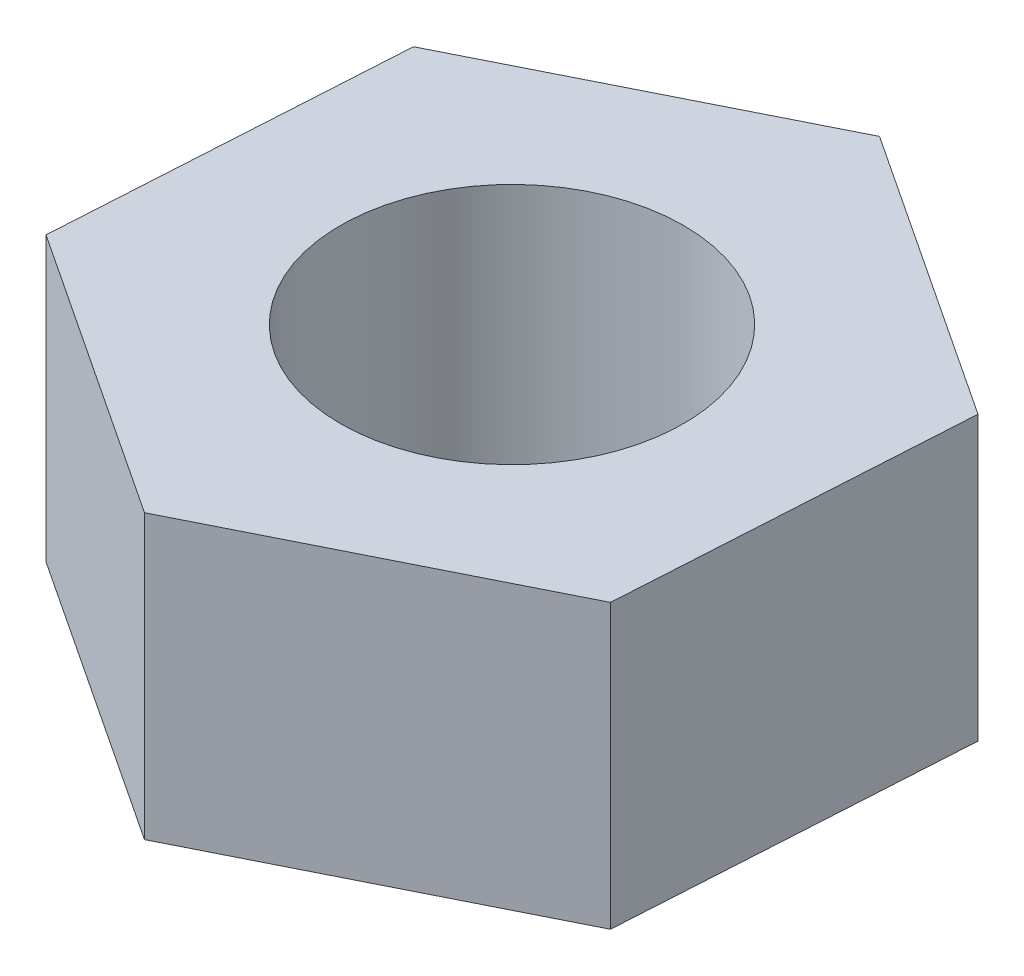
ISO-10303-21;
HEADER;
FILE_DESCRIPTION(('STEP AP214'),'2;1');
FILE_NAME('part.step','',(''),(''),'','','');
FILE_SCHEMA(('AUTOMOTIVE_DESIGN { 1 0 10303 214 1 1 1 1 }'));
ENDSEC;
DATA;
#1=APPLICATION_CONTEXT('core data for automotive mechanical design processes');
#2=APPLICATION_PROTOCOL_DEFINITION('international standard','automotive_design',2000,#1);
#3=PRODUCT_CONTEXT('',#1,'mechanical');
#4=PRODUCT('Part','Part','',(#3));
#5=PRODUCT_RELATED_PRODUCT_CATEGORY('part','',(#4));
#6=PRODUCT_DEFINITION_FORMATION('','',#4);
#7=PRODUCT_DEFINITION_CONTEXT('part definition',#1,'design');
#8=PRODUCT_DEFINITION('design','',#6,#7);
#9=PRODUCT_DEFINITION_SHAPE('','',#8);
#10=(LENGTH_UNIT() NAMED_UNIT(*) SI_UNIT(.MILLI.,.METRE.));
#11=(NAMED_UNIT(*) PLANE_ANGLE_UNIT() SI_UNIT($,.RADIAN.));
#12=(NAMED_UNIT(*) SI_UNIT($,.STERADIAN.) SOLID_ANGLE_UNIT());
#13=UNCERTAINTY_MEASURE_WITH_UNIT(LENGTH_MEASURE(1.E-05),#10,'distance_accuracy_value','');
#14=(GEOMETRIC_REPRESENTATION_CONTEXT(3) GLOBAL_UNCERTAINTY_ASSIGNED_CONTEXT((#13)) GLOBAL_UNIT_ASSIGNED_CONTEXT((#10,
#11,#12)) REPRESENTATION_CONTEXT('',''));
#15=CARTESIAN_POINT('',(0.,0.,0.));
#16=DIRECTION('',(0.,0.,1.));
#17=DIRECTION('',(1.,0.,0.));
#18=AXIS2_PLACEMENT_3D('',#15,#16,#17);
#19=CARTESIAN_POINT('',(1.77635683940025E-12,7.99999999999201,0.));
#20=DIRECTION('',(0.,1.,0.));
#21=DIRECTION('',(0.,0.,1.));
#22=AXIS2_PLACEMENT_3D('',#19,#20,#21);
#23=PLANE('',#22);
#24=DIRECTION('',(-0.0599152608792087,0.,0.998203466991464));
#25=VECTOR('',#24,1.);
#26=CARTESIAN_POINT('',(-8.1906966874512,7.99999999999823,-5.40794056064842));
#27=LINE('',#26,#25);
#28=CARTESIAN_POINT('',(-8.1906966874512,7.99999999999823,-5.40794056064842));
#29=VERTEX_POINT('',#28);
#30=CARTESIAN_POINT('',(-8.77876225140284,7.99999999999823,4.38938112570098));
#31=VERTEX_POINT('',#30);
#32=EDGE_CURVE('E128',#29,#31,#27,.T.);
#33=ORIENTED_EDGE('',*,*,#32,.T.);
#34=DIRECTION('',(0.834511930120703,0.,0.550989871491497));
#35=VECTOR('',#34,1.);
#36=CARTESIAN_POINT('',(-8.77876225140284,7.99999999999823,4.38938112570098));
#37=LINE('',#36,#35);
#38=CARTESIAN_POINT('',(-0.588065563952966,7.99999999999379,9.79732168634939));
#39=VERTEX_POINT('',#38);
#40=EDGE_CURVE('E86',#31,#39,#37,.T.);
#41=ORIENTED_EDGE('',*,*,#40,.T.);
#42=DIRECTION('',(0.894427190999911,0.,-0.447213595499967));
#43=VECTOR('',#42,1.);
#44=CARTESIAN_POINT('',(-0.588065563952966,7.99999999999379,9.79732168634939));
#45=LINE('',#44,#43);
#46=CARTESIAN_POINT('',(8.19069668745254,7.99999999999645,5.40794056064797));
#47=VERTEX_POINT('',#46);
#48=EDGE_CURVE('E99',#39,#47,#45,.T.);
#49=ORIENTED_EDGE('',*,*,#48,.T.);
#50=DIRECTION('',(0.0599152608792083,0.,-0.998203466991464));
#51=VECTOR('',#50,1.);
#52=CARTESIAN_POINT('',(8.19069668745254,7.99999999999645,5.40794056064797));
#53=LINE('',#52,#51);
#54=CARTESIAN_POINT('',(8.77876225140461,7.99999999999912,-4.38938112570364));
#55=VERTEX_POINT('',#54);
#56=EDGE_CURVE('E93',#47,#55,#53,.T.);
#57=ORIENTED_EDGE('',*,*,#56,.T.);
#58=DIRECTION('',(-0.834511930120703,0.,-0.550989871491497));
#59=VECTOR('',#58,1.);
#60=CARTESIAN_POINT('',(8.77876225140461,7.99999999999912,-4.38938112570364));
#61=LINE('',#60,#59);
#62=CARTESIAN_POINT('',(0.588065563950302,7.99999999999557,-9.79732168634984));
#63=VERTEX_POINT('',#62);
#64=EDGE_CURVE('E97',#55,#63,#61,.T.);
#65=ORIENTED_EDGE('',*,*,#64,.T.);
#66=DIRECTION('',(-0.894427190999911,0.,0.447213595499967));
#67=VECTOR('',#66,1.);
#68=CARTESIAN_POINT('',(0.588065563950302,7.99999999999557,-9.79732168634984));
#69=LINE('',#68,#67);
#70=EDGE_CURVE('E49',#63,#29,#69,.T.);
#71=ORIENTED_EDGE('',*,*,#70,.T.);
#72=EDGE_LOOP('',(#33,#41,#49,#57,#65,#71));
#73=FACE_BOUND('',#72,.T.);
#74=CARTESIAN_POINT('',(1.77635683940025E-12,7.99999999999201,0.));
#75=DIRECTION('',(0.,1.,0.));
#76=DIRECTION('',(0.,0.,1.));
#77=AXIS2_PLACEMENT_3D('',#74,#75,#76);
#78=CIRCLE('',#77,4.85);
#79=CARTESIAN_POINT('',(1.77348326589654E-12,7.99999999999201,4.85000000000001));
#80=VERTEX_POINT('',#79);
#81=EDGE_CURVE('E121',#80,#80,#78,.T.);
#82=ORIENTED_EDGE('',*,*,#81,.F.);
#83=EDGE_LOOP('',(#82));
#84=FACE_BOUND('',#83,.T.);
#85=ADVANCED_FACE('F32',(#73,#84),#23,.T.);
#86=CARTESIAN_POINT('',(0.,0.,0.));
#87=DIRECTION('',(0.,1.,0.));
#88=DIRECTION('',(0.,0.,1.));
#89=AXIS2_PLACEMENT_3D('',#86,#87,#88);
#90=PLANE('',#89);
#91=DIRECTION('',(-0.0599152608792087,0.,0.998203466991464));
#92=VECTOR('',#91,1.);
#93=CARTESIAN_POINT('',(-8.19069668745076,-1.77635683940025E-12,-5.40794056064886));
#94=LINE('',#93,#92);
#95=CARTESIAN_POINT('',(-8.19069668745076,-1.77635683940025E-12,-5.40794056064886));
#96=VERTEX_POINT('',#95);
#97=CARTESIAN_POINT('',(-8.77876225140328,-2.66453525910038E-12,4.38938112570231));
#98=VERTEX_POINT('',#97);
#99=EDGE_CURVE('E117',#96,#98,#94,.T.);
#100=ORIENTED_EDGE('',*,*,#99,.F.);
#101=DIRECTION('',(-0.894427190999911,0.,0.447213595499967));
#102=VECTOR('',#101,1.);
#103=CARTESIAN_POINT('',(0.588065563951634,3.5527136788005E-12,-9.79732168635072));
#104=LINE('',#103,#102);
#105=CARTESIAN_POINT('',(0.588065563951634,3.5527136788005E-12,-9.79732168635072));
#106=VERTEX_POINT('',#105);
#107=EDGE_CURVE('E78',#106,#96,#104,.T.);
#108=ORIENTED_EDGE('',*,*,#107,.F.);
#109=DIRECTION('',(-0.834511930120703,0.,-0.550989871491497));
#110=VECTOR('',#109,1.);
#111=CARTESIAN_POINT('',(8.77876225140328,-6.21724893790088E-12,-4.38938112570275));
#112=LINE('',#111,#110);
#113=CARTESIAN_POINT('',(8.77876225140328,-6.21724893790088E-12,-4.38938112570275));
#114=VERTEX_POINT('',#113);
#115=EDGE_CURVE('E72',#114,#106,#112,.T.);
#116=ORIENTED_EDGE('',*,*,#115,.F.);
#117=DIRECTION('',(0.0599152608792083,0.,-0.998203466991464));
#118=VECTOR('',#117,1.);
#119=CARTESIAN_POINT('',(8.19069668745165,0.,5.40794056064797));
#120=LINE('',#119,#118);
#121=CARTESIAN_POINT('',(8.19069668745165,0.,5.40794056064797));
#122=VERTEX_POINT('',#121);
#123=EDGE_CURVE('E107',#122,#114,#120,.T.);
#124=ORIENTED_EDGE('',*,*,#123,.F.);
#125=DIRECTION('',(0.894427190999911,0.,-0.447213595499967));
#126=VECTOR('',#125,1.);
#127=CARTESIAN_POINT('',(-0.588065563950746,-4.44089209850063E-12,9.79732168635072));
#128=LINE('',#127,#126);
#129=CARTESIAN_POINT('',(-0.588065563950746,-4.44089209850063E-12,9.79732168635072));
#130=VERTEX_POINT('',#129);
#131=EDGE_CURVE('E123',#130,#122,#128,.T.);
#132=ORIENTED_EDGE('',*,*,#131,.F.);
#133=DIRECTION('',(0.834511930120703,0.,0.550989871491497));
#134=VECTOR('',#133,1.);
#135=CARTESIAN_POINT('',(-8.77876225140328,-2.66453525910038E-12,4.38938112570231));
#136=LINE('',#135,#134);
#137=EDGE_CURVE('E120',#98,#130,#136,.T.);
#138=ORIENTED_EDGE('',*,*,#137,.F.);
#139=EDGE_LOOP('',(#100,#108,#116,#124,#132,#138));
#140=FACE_BOUND('',#139,.T.);
#141=CARTESIAN_POINT('',(0.,0.,0.));
#142=DIRECTION('',(0.,1.,0.));
#143=DIRECTION('',(0.,0.,1.));
#144=AXIS2_PLACEMENT_3D('',#141,#142,#143);
#145=CIRCLE('',#144,4.85);
#146=CARTESIAN_POINT('',(0.,0.,4.85000000000001));
#147=VERTEX_POINT('',#146);
#148=EDGE_CURVE('E221',#147,#147,#145,.T.);
#149=ORIENTED_EDGE('',*,*,#148,.T.);
#150=EDGE_LOOP('',(#149));
#151=FACE_BOUND('',#150,.T.);
#152=ADVANCED_FACE('F137',(#140,#151),#90,.F.);
#153=CARTESIAN_POINT('',(-8.1906966874512,7.99999999999823,-5.40794056064842));
#154=DIRECTION('',(0.998203466991461,0.,0.0599152608792065));
#155=DIRECTION('',(0.0599152608792087,0.,-0.998203466991464));
#156=AXIS2_PLACEMENT_3D('',#153,#154,#155);
#157=PLANE('',#156);
#158=ORIENTED_EDGE('',*,*,#99,.T.);
#159=DIRECTION('',(0.,-1.,0.));
#160=VECTOR('',#159,1.);
#161=CARTESIAN_POINT('',(-8.77876225140284,7.99999999999823,4.38938112570098));
#162=LINE('',#161,#160);
#163=EDGE_CURVE('E11',#31,#98,#162,.T.);
#164=ORIENTED_EDGE('',*,*,#163,.F.);
#165=ORIENTED_EDGE('',*,*,#32,.F.);
#166=DIRECTION('',(0.,-1.,0.));
#167=VECTOR('',#166,1.);
#168=CARTESIAN_POINT('',(-8.1906966874512,7.99999999999823,-5.40794056064842));
#169=LINE('',#168,#167);
#170=EDGE_CURVE('E113',#29,#96,#169,.T.);
#171=ORIENTED_EDGE('',*,*,#170,.T.);
#172=EDGE_LOOP('',(#158,#164,#165,#171));
#173=FACE_BOUND('',#172,.T.);
#174=ADVANCED_FACE('F34',(#173),#157,.F.);
#175=CARTESIAN_POINT('',(-8.77876225140284,7.99999999999823,4.38938112570098));
#176=DIRECTION('',(0.550989871491498,0.,-0.834511930120705));
#177=DIRECTION('',(-0.834511930120703,0.,-0.550989871491497));
#178=AXIS2_PLACEMENT_3D('',#175,#176,#177);
#179=PLANE('',#178);
#180=ORIENTED_EDGE('',*,*,#137,.T.);
#181=DIRECTION('',(0.,-1.,0.));
#182=VECTOR('',#181,1.);
#183=CARTESIAN_POINT('',(-0.588065563952966,7.99999999999379,9.79732168634939));
#184=LINE('',#183,#182);
#185=EDGE_CURVE('E41',#39,#130,#184,.T.);
#186=ORIENTED_EDGE('',*,*,#185,.F.);
#187=ORIENTED_EDGE('',*,*,#40,.F.);
#188=ORIENTED_EDGE('',*,*,#163,.T.);
#189=EDGE_LOOP('',(#180,#186,#187,#188));
#190=FACE_BOUND('',#189,.T.);
#191=ADVANCED_FACE('F162',(#190),#179,.F.);
#192=CARTESIAN_POINT('',(-0.588065563952966,7.99999999999379,9.79732168634939));
#193=DIRECTION('',(-0.447213595499965,0.,-0.894427190999914));
#194=DIRECTION('',(-0.894427190999911,0.,0.447213595499967));
#195=AXIS2_PLACEMENT_3D('',#192,#193,#194);
#196=PLANE('',#195);
#197=ORIENTED_EDGE('',*,*,#131,.T.);
#198=DIRECTION('',(0.,-1.,0.));
#199=VECTOR('',#198,1.);
#200=CARTESIAN_POINT('',(8.19069668745254,7.99999999999645,5.40794056064797));
#201=LINE('',#200,#199);
#202=EDGE_CURVE('E108',#47,#122,#201,.T.);
#203=ORIENTED_EDGE('',*,*,#202,.F.);
#204=ORIENTED_EDGE('',*,*,#48,.F.);
#205=ORIENTED_EDGE('',*,*,#185,.T.);
#206=EDGE_LOOP('',(#197,#203,#204,#205));
#207=FACE_BOUND('',#206,.T.);
#208=ADVANCED_FACE('F134',(#207),#196,.F.);
#209=CARTESIAN_POINT('',(8.19069668745254,7.99999999999645,5.40794056064797));
#210=DIRECTION('',(-0.998203466991461,0.,-0.0599152608792071));
#211=DIRECTION('',(-0.0599152608792083,0.,0.998203466991464));
#212=AXIS2_PLACEMENT_3D('',#209,#210,#211);
#213=PLANE('',#212);
#214=ORIENTED_EDGE('',*,*,#123,.T.);
#215=DIRECTION('',(0.,-1.,0.));
#216=VECTOR('',#215,1.);
#217=CARTESIAN_POINT('',(8.77876225140461,7.99999999999912,-4.38938112570364));
#218=LINE('',#217,#216);
#219=EDGE_CURVE('E104',#55,#114,#218,.T.);
#220=ORIENTED_EDGE('',*,*,#219,.F.);
#221=ORIENTED_EDGE('',*,*,#56,.F.);
#222=ORIENTED_EDGE('',*,*,#202,.T.);
#223=EDGE_LOOP('',(#214,#220,#221,#222));
#224=FACE_BOUND('',#223,.T.);
#225=ADVANCED_FACE('F105',(#224),#213,.F.);
#226=CARTESIAN_POINT('',(8.77876225140461,7.99999999999912,-4.38938112570364));
#227=DIRECTION('',(-0.550989871491498,0.,0.834511930120705));
#228=DIRECTION('',(0.834511930120703,0.,0.550989871491497));
#229=AXIS2_PLACEMENT_3D('',#226,#227,#228);
#230=PLANE('',#229);
#231=ORIENTED_EDGE('',*,*,#115,.T.);
#232=DIRECTION('',(0.,-1.,0.));
#233=VECTOR('',#232,1.);
#234=CARTESIAN_POINT('',(0.588065563950302,7.99999999999557,-9.79732168634984));
#235=LINE('',#234,#233);
#236=EDGE_CURVE('E109',#63,#106,#235,.T.);
#237=ORIENTED_EDGE('',*,*,#236,.F.);
#238=ORIENTED_EDGE('',*,*,#64,.F.);
#239=ORIENTED_EDGE('',*,*,#219,.T.);
#240=EDGE_LOOP('',(#231,#237,#238,#239));
#241=FACE_BOUND('',#240,.T.);
#242=ADVANCED_FACE('F111',(#241),#230,.F.);
#243=CARTESIAN_POINT('',(0.588065563950302,7.99999999999557,-9.79732168634984));
#244=DIRECTION('',(0.447213595499965,0.,0.894427190999914));
#245=DIRECTION('',(0.894427190999911,0.,-0.447213595499967));
#246=AXIS2_PLACEMENT_3D('',#243,#244,#245);
#247=PLANE('',#246);
#248=ORIENTED_EDGE('',*,*,#107,.T.);
#249=ORIENTED_EDGE('',*,*,#170,.F.);
#250=ORIENTED_EDGE('',*,*,#70,.F.);
#251=ORIENTED_EDGE('',*,*,#236,.T.);
#252=EDGE_LOOP('',(#248,#249,#250,#251));
#253=FACE_BOUND('',#252,.T.);
#254=ADVANCED_FACE('F142',(#253),#247,.F.);
#255=CARTESIAN_POINT('',(1.77635683940025E-12,7.99999999999201,0.));
#256=DIRECTION('',(0.,-1.,0.));
#257=DIRECTION('',(0.,0.,-1.));
#258=AXIS2_PLACEMENT_3D('',#255,#256,#257);
#259=CYLINDRICAL_SURFACE('',#258,4.85);
#260=ORIENTED_EDGE('',*,*,#81,.T.);
#261=EDGE_LOOP('',(#260));
#262=FACE_BOUND('',#261,.T.);
#263=ORIENTED_EDGE('',*,*,#148,.F.);
#264=EDGE_LOOP('',(#263));
#265=FACE_BOUND('',#264,.T.);
#266=ADVANCED_FACE('F144',(#262,#265),#259,.F.);
#267=CLOSED_SHELL('',(#85,#152,#174,#191,#208,#225,#242,#254,#266));
#268=MANIFOLD_SOLID_BREP('B2',#267);
#269=ADVANCED_BREP_SHAPE_REPRESENTATION('',(#18,#268),#14);
#270=SHAPE_DEFINITION_REPRESENTATION(#9,#269);
ENDSEC;
END-ISO-10303-21;
